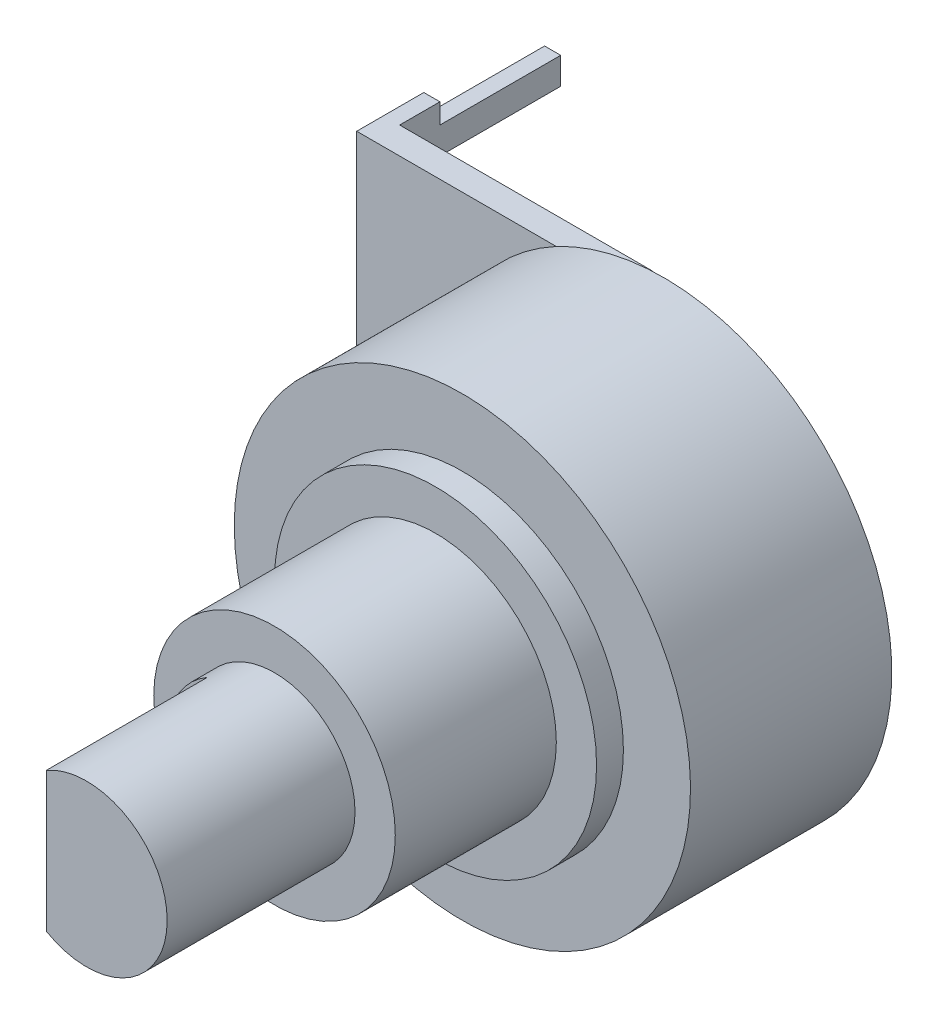
ISO-10303-21;
HEADER;
FILE_DESCRIPTION(('STEP AP214'),'2;1');
FILE_NAME('part.step','',(''),(''),'','','');
FILE_SCHEMA(('AUTOMOTIVE_DESIGN { 1 0 10303 214 1 1 1 1 }'));
ENDSEC;
DATA;
#1=APPLICATION_CONTEXT('core data for automotive mechanical design processes');
#2=APPLICATION_PROTOCOL_DEFINITION('international standard','automotive_design',2000,#1);
#3=PRODUCT_CONTEXT('',#1,'mechanical');
#4=PRODUCT('Part','Part','',(#3));
#5=PRODUCT_RELATED_PRODUCT_CATEGORY('part','',(#4));
#6=PRODUCT_DEFINITION_FORMATION('','',#4);
#7=PRODUCT_DEFINITION_CONTEXT('part definition',#1,'design');
#8=PRODUCT_DEFINITION('design','',#6,#7);
#9=PRODUCT_DEFINITION_SHAPE('','',#8);
#10=(LENGTH_UNIT() NAMED_UNIT(*) SI_UNIT(.MILLI.,.METRE.));
#11=(NAMED_UNIT(*) PLANE_ANGLE_UNIT() SI_UNIT($,.RADIAN.));
#12=(NAMED_UNIT(*) SI_UNIT($,.STERADIAN.) SOLID_ANGLE_UNIT());
#13=UNCERTAINTY_MEASURE_WITH_UNIT(LENGTH_MEASURE(1.E-05),#10,'distance_accuracy_value','');
#14=(GEOMETRIC_REPRESENTATION_CONTEXT(3) GLOBAL_UNCERTAINTY_ASSIGNED_CONTEXT((#13)) GLOBAL_UNIT_ASSIGNED_CONTEXT((#10,
#11,#12)) REPRESENTATION_CONTEXT('',''));
#15=CARTESIAN_POINT('',(0.,0.,0.));
#16=DIRECTION('',(0.,0.,1.));
#17=DIRECTION('',(1.,0.,0.));
#18=AXIS2_PLACEMENT_3D('',#15,#16,#17);
#19=CARTESIAN_POINT('',(0.,0.,-9.5));
#20=DIRECTION('',(0.,0.,-1.));
#21=DIRECTION('',(-1.,0.,0.));
#22=AXIS2_PLACEMENT_3D('',#19,#20,#21);
#23=PLANE('',#22);
#24=DIRECTION('',(0.,-1.,0.));
#25=VECTOR('',#24,1.);
#26=CARTESIAN_POINT('',(-10.8374973362315,-5.,-9.5));
#27=LINE('',#26,#25);
#28=CARTESIAN_POINT('',(-10.8374973362315,-5.,-9.5));
#29=VERTEX_POINT('',#28);
#30=CARTESIAN_POINT('',(-10.8374973362315,-7.5,-9.5));
#31=VERTEX_POINT('',#30);
#32=EDGE_CURVE('E399',#29,#31,#27,.T.);
#33=ORIENTED_EDGE('',*,*,#32,.F.);
#34=DIRECTION('',(1.,0.,0.));
#35=VECTOR('',#34,1.);
#36=CARTESIAN_POINT('',(-11.4374973362315,-5.,-9.5));
#37=LINE('',#36,#35);
#38=CARTESIAN_POINT('',(-11.4374973362315,-5.,-9.5));
#39=VERTEX_POINT('',#38);
#40=EDGE_CURVE('E403',#39,#29,#37,.T.);
#41=ORIENTED_EDGE('',*,*,#40,.F.);
#42=DIRECTION('',(0.,1.,0.));
#43=VECTOR('',#42,1.);
#44=CARTESIAN_POINT('',(-11.4374973362315,7.5,-9.5));
#45=LINE('',#44,#43);
#46=CARTESIAN_POINT('',(-11.4374973362315,-1.25,-9.5));
#47=VERTEX_POINT('',#46);
#48=EDGE_CURVE('E271',#39,#47,#45,.T.);
#49=ORIENTED_EDGE('',*,*,#48,.T.);
#50=DIRECTION('',(-1.,0.,0.));
#51=VECTOR('',#50,1.);
#52=CARTESIAN_POINT('',(-11.4374973362315,-1.25,-9.5));
#53=LINE('',#52,#51);
#54=CARTESIAN_POINT('',(-10.8374973362315,-1.25,-9.5));
#55=VERTEX_POINT('',#54);
#56=EDGE_CURVE('E381',#55,#47,#53,.T.);
#57=ORIENTED_EDGE('',*,*,#56,.F.);
#58=DIRECTION('',(0.,-1.,0.));
#59=VECTOR('',#58,1.);
#60=CARTESIAN_POINT('',(-10.8374973362315,1.25,-9.5));
#61=LINE('',#60,#59);
#62=CARTESIAN_POINT('',(-10.8374973362315,1.25,-9.5));
#63=VERTEX_POINT('',#62);
#64=EDGE_CURVE('E385',#63,#55,#61,.T.);
#65=ORIENTED_EDGE('',*,*,#64,.F.);
#66=DIRECTION('',(1.,0.,0.));
#67=VECTOR('',#66,1.);
#68=CARTESIAN_POINT('',(-11.4374973362315,1.25,-9.5));
#69=LINE('',#68,#67);
#70=CARTESIAN_POINT('',(-11.4374973362315,1.25,-9.5));
#71=VERTEX_POINT('',#70);
#72=EDGE_CURVE('E373',#71,#63,#69,.T.);
#73=ORIENTED_EDGE('',*,*,#72,.F.);
#74=CARTESIAN_POINT('',(-11.4374973362315,5.,-9.5));
#75=VERTEX_POINT('',#74);
#76=EDGE_CURVE('E270',#71,#75,#45,.T.);
#77=ORIENTED_EDGE('',*,*,#76,.T.);
#78=DIRECTION('',(-1.,0.,0.));
#79=VECTOR('',#78,1.);
#80=CARTESIAN_POINT('',(-11.4374973362315,5.,-9.5));
#81=LINE('',#80,#79);
#82=CARTESIAN_POINT('',(-10.8374973362315,5.,-9.5));
#83=VERTEX_POINT('',#82);
#84=EDGE_CURVE('E244',#83,#75,#81,.T.);
#85=ORIENTED_EDGE('',*,*,#84,.F.);
#86=DIRECTION('',(0.,-1.,0.));
#87=VECTOR('',#86,1.);
#88=CARTESIAN_POINT('',(-10.8374973362315,7.5,-9.5));
#89=LINE('',#88,#87);
#90=CARTESIAN_POINT('',(-10.8374973362315,7.5,-9.5));
#91=VERTEX_POINT('',#90);
#92=EDGE_CURVE('E249',#91,#83,#89,.T.);
#93=ORIENTED_EDGE('',*,*,#92,.F.);
#94=DIRECTION('',(1.,0.,0.));
#95=VECTOR('',#94,1.);
#96=CARTESIAN_POINT('',(-1.43749733623151,7.5,-9.5));
#97=LINE('',#96,#95);
#98=CARTESIAN_POINT('',(-1.43749733623151,7.5,-9.5));
#99=VERTEX_POINT('',#98);
#100=EDGE_CURVE('E274',#91,#99,#97,.T.);
#101=ORIENTED_EDGE('',*,*,#100,.T.);
#102=DIRECTION('',(0.,-1.,0.));
#103=VECTOR('',#102,1.);
#104=CARTESIAN_POINT('',(-1.43749733623151,7.5,-9.5));
#105=LINE('',#104,#103);
#106=CARTESIAN_POINT('',(-1.43749733623151,-7.5,-9.5));
#107=VERTEX_POINT('',#106);
#108=EDGE_CURVE('E263',#99,#107,#105,.T.);
#109=ORIENTED_EDGE('',*,*,#108,.T.);
#110=DIRECTION('',(-1.,0.,0.));
#111=VECTOR('',#110,1.);
#112=CARTESIAN_POINT('',(-1.43749733623151,-7.5,-9.5));
#113=LINE('',#112,#111);
#114=EDGE_CURVE('E266',#107,#31,#113,.T.);
#115=ORIENTED_EDGE('',*,*,#114,.T.);
#116=EDGE_LOOP('',(#33,#41,#49,#57,#65,#73,#77,#85,#93,#101,#109,#115));
#117=FACE_BOUND('',#116,.T.);
#118=ADVANCED_FACE('F35',(#117),#23,.T.);
#119=CARTESIAN_POINT('',(0.,0.,6.));
#120=DIRECTION('',(0.,0.,-1.));
#121=DIRECTION('',(-1.,0.,0.));
#122=AXIS2_PLACEMENT_3D('',#119,#120,#121);
#123=CYLINDRICAL_SURFACE('',#122,4.5);
#124=CARTESIAN_POINT('',(0.,0.,6.));
#125=DIRECTION('',(0.,0.,1.));
#126=DIRECTION('',(1.,0.,0.));
#127=AXIS2_PLACEMENT_3D('',#124,#125,#126);
#128=CIRCLE('',#127,4.5);
#129=CARTESIAN_POINT('',(4.5,0.,6.));
#130=VERTEX_POINT('',#129);
#131=EDGE_CURVE('E323',#130,#130,#128,.T.);
#132=ORIENTED_EDGE('',*,*,#131,.F.);
#133=EDGE_LOOP('',(#132));
#134=FACE_BOUND('',#133,.T.);
#135=CARTESIAN_POINT('',(0.,0.,0.));
#136=DIRECTION('',(0.,0.,1.));
#137=DIRECTION('',(1.,0.,0.));
#138=AXIS2_PLACEMENT_3D('',#135,#136,#137);
#139=CIRCLE('',#138,4.5);
#140=CARTESIAN_POINT('',(4.5,0.,0.));
#141=VERTEX_POINT('',#140);
#142=EDGE_CURVE('E308',#141,#141,#139,.T.);
#143=ORIENTED_EDGE('',*,*,#142,.T.);
#144=EDGE_LOOP('',(#143));
#145=FACE_BOUND('',#144,.T.);
#146=ADVANCED_FACE('F37',(#134,#145),#123,.T.);
#147=CARTESIAN_POINT('',(0.,0.,6.));
#148=DIRECTION('',(0.,0.,1.));
#149=DIRECTION('',(1.,0.,0.));
#150=AXIS2_PLACEMENT_3D('',#147,#148,#149);
#151=PLANE('',#150);
#152=CARTESIAN_POINT('',(0.,0.,6.));
#153=DIRECTION('',(0.,0.,1.));
#154=DIRECTION('',(1.,0.,0.));
#155=AXIS2_PLACEMENT_3D('',#152,#153,#154);
#156=CIRCLE('',#155,3.);
#157=CARTESIAN_POINT('',(3.,0.,6.));
#158=VERTEX_POINT('',#157);
#159=EDGE_CURVE('E324',#158,#158,#156,.T.);
#160=ORIENTED_EDGE('',*,*,#159,.F.);
#161=EDGE_LOOP('',(#160));
#162=FACE_BOUND('',#161,.T.);
#163=ORIENTED_EDGE('',*,*,#131,.T.);
#164=EDGE_LOOP('',(#163));
#165=FACE_BOUND('',#164,.T.);
#166=ADVANCED_FACE('F535',(#162,#165),#151,.T.);
#167=CARTESIAN_POINT('',(0.,0.,13.));
#168=DIRECTION('',(0.,0.,-1.));
#169=DIRECTION('',(-1.,0.,0.));
#170=AXIS2_PLACEMENT_3D('',#167,#168,#169);
#171=CYLINDRICAL_SURFACE('',#170,3.);
#172=CARTESIAN_POINT('',(0.,0.,13.));
#173=DIRECTION('',(0.,0.,1.));
#174=DIRECTION('',(1.,0.,0.));
#175=AXIS2_PLACEMENT_3D('',#172,#173,#174);
#176=CIRCLE('',#175,3.);
#177=CARTESIAN_POINT('',(-1.5,-2.59807621135332,13.));
#178=VERTEX_POINT('',#177);
#179=CARTESIAN_POINT('',(-1.5,2.59807621135332,13.));
#180=VERTEX_POINT('',#179);
#181=EDGE_CURVE('E320',#178,#180,#176,.T.);
#182=ORIENTED_EDGE('',*,*,#181,.F.);
#183=DIRECTION('',(0.,0.,-1.));
#184=VECTOR('',#183,1.);
#185=CARTESIAN_POINT('',(-1.5,-2.59807621135332,13.));
#186=LINE('',#185,#184);
#187=CARTESIAN_POINT('',(-1.5,-2.59807621135332,7.));
#188=VERTEX_POINT('',#187);
#189=EDGE_CURVE('E317',#178,#188,#186,.T.);
#190=ORIENTED_EDGE('',*,*,#189,.T.);
#191=CARTESIAN_POINT('',(0.,0.,7.));
#192=DIRECTION('',(0.,0.,1.));
#193=DIRECTION('',(1.,0.,0.));
#194=AXIS2_PLACEMENT_3D('',#191,#192,#193);
#195=CIRCLE('',#194,3.);
#196=CARTESIAN_POINT('',(-1.5,2.59807621135332,7.));
#197=VERTEX_POINT('',#196);
#198=EDGE_CURVE('E333',#197,#188,#195,.T.);
#199=ORIENTED_EDGE('',*,*,#198,.F.);
#200=DIRECTION('',(0.,0.,-1.));
#201=VECTOR('',#200,1.);
#202=CARTESIAN_POINT('',(-1.5,2.59807621135332,13.));
#203=LINE('',#202,#201);
#204=EDGE_CURVE('E314',#197,#180,#203,.F.);
#205=ORIENTED_EDGE('',*,*,#204,.T.);
#206=EDGE_LOOP('',(#182,#190,#199,#205));
#207=FACE_BOUND('',#206,.T.);
#208=ORIENTED_EDGE('',*,*,#159,.T.);
#209=EDGE_LOOP('',(#208));
#210=FACE_BOUND('',#209,.T.);
#211=ADVANCED_FACE('F578',(#207,#210),#171,.T.);
#212=CARTESIAN_POINT('',(0.,0.,13.));
#213=DIRECTION('',(0.,0.,1.));
#214=DIRECTION('',(1.,0.,0.));
#215=AXIS2_PLACEMENT_3D('',#212,#213,#214);
#216=PLANE('',#215);
#217=DIRECTION('',(0.,1.,0.));
#218=VECTOR('',#217,1.);
#219=CARTESIAN_POINT('',(-1.5,0.,13.));
#220=LINE('',#219,#218);
#221=EDGE_CURVE('E327',#178,#180,#220,.T.);
#222=ORIENTED_EDGE('',*,*,#221,.F.);
#223=ORIENTED_EDGE('',*,*,#181,.T.);
#224=EDGE_LOOP('',(#222,#223));
#225=FACE_BOUND('',#224,.T.);
#226=ADVANCED_FACE('F572',(#225),#216,.T.);
#227=CARTESIAN_POINT('',(0.,0.,7.));
#228=DIRECTION('',(0.,0.,1.));
#229=DIRECTION('',(1.,0.,0.));
#230=AXIS2_PLACEMENT_3D('',#227,#228,#229);
#231=PLANE('',#230);
#232=ORIENTED_EDGE('',*,*,#198,.T.);
#233=DIRECTION('',(0.,1.,0.));
#234=VECTOR('',#233,1.);
#235=CARTESIAN_POINT('',(-1.5,3.61488300728811,7.));
#236=LINE('',#235,#234);
#237=EDGE_CURVE('E311',#188,#197,#236,.T.);
#238=ORIENTED_EDGE('',*,*,#237,.T.);
#239=EDGE_LOOP('',(#232,#238));
#240=FACE_BOUND('',#239,.T.);
#241=ADVANCED_FACE('F569',(#240),#231,.T.);
#242=CARTESIAN_POINT('',(-1.5,3.61488300728811,7.));
#243=DIRECTION('',(1.,0.,0.));
#244=DIRECTION('',(0.,1.,0.));
#245=AXIS2_PLACEMENT_3D('',#242,#243,#244);
#246=PLANE('',#245);
#247=ORIENTED_EDGE('',*,*,#221,.T.);
#248=ORIENTED_EDGE('',*,*,#204,.F.);
#249=ORIENTED_EDGE('',*,*,#237,.F.);
#250=ORIENTED_EDGE('',*,*,#189,.F.);
#251=EDGE_LOOP('',(#247,#248,#249,#250));
#252=FACE_BOUND('',#251,.T.);
#253=ADVANCED_FACE('F567',(#252),#246,.F.);
#254=CARTESIAN_POINT('',(0.,0.,-1.));
#255=DIRECTION('',(0.,0.,1.));
#256=DIRECTION('',(1.,0.,0.));
#257=AXIS2_PLACEMENT_3D('',#254,#255,#256);
#258=CYLINDRICAL_SURFACE('',#257,6.);
#259=CARTESIAN_POINT('',(0.,0.,-1.));
#260=DIRECTION('',(0.,0.,-1.));
#261=DIRECTION('',(-1.,0.,0.));
#262=AXIS2_PLACEMENT_3D('',#259,#260,#261);
#263=CIRCLE('',#262,6.);
#264=CARTESIAN_POINT('',(-6.,0.,-1.));
#265=VERTEX_POINT('',#264);
#266=EDGE_CURVE('E305',#265,#265,#263,.T.);
#267=ORIENTED_EDGE('',*,*,#266,.F.);
#268=EDGE_LOOP('',(#267));
#269=FACE_BOUND('',#268,.T.);
#270=CARTESIAN_POINT('',(0.,0.,0.));
#271=DIRECTION('',(0.,0.,-1.));
#272=DIRECTION('',(-1.,0.,0.));
#273=AXIS2_PLACEMENT_3D('',#270,#271,#272);
#274=CIRCLE('',#273,6.);
#275=CARTESIAN_POINT('',(-6.,0.,0.));
#276=VERTEX_POINT('',#275);
#277=EDGE_CURVE('E301',#276,#276,#274,.T.);
#278=ORIENTED_EDGE('',*,*,#277,.T.);
#279=EDGE_LOOP('',(#278));
#280=FACE_BOUND('',#279,.T.);
#281=ADVANCED_FACE('F564',(#269,#280),#258,.T.);
#282=CARTESIAN_POINT('',(0.,0.,0.));
#283=DIRECTION('',(0.,0.,-1.));
#284=DIRECTION('',(-1.,0.,0.));
#285=AXIS2_PLACEMENT_3D('',#282,#283,#284);
#286=PLANE('',#285);
#287=ORIENTED_EDGE('',*,*,#142,.F.);
#288=EDGE_LOOP('',(#287));
#289=FACE_BOUND('',#288,.T.);
#290=ORIENTED_EDGE('',*,*,#277,.F.);
#291=EDGE_LOOP('',(#290));
#292=FACE_BOUND('',#291,.T.);
#293=ADVANCED_FACE('F560',(#289,#292),#286,.F.);
#294=CARTESIAN_POINT('',(0.,0.,-8.5));
#295=DIRECTION('',(0.,0.,1.));
#296=DIRECTION('',(1.,0.,0.));
#297=AXIS2_PLACEMENT_3D('',#294,#295,#296);
#298=CYLINDRICAL_SURFACE('',#297,8.5);
#299=CARTESIAN_POINT('',(0.,0.,-8.5));
#300=DIRECTION('',(0.,0.,-1.));
#301=DIRECTION('',(-1.,0.,0.));
#302=AXIS2_PLACEMENT_3D('',#299,#300,#301);
#303=CIRCLE('',#302,8.5);
#304=CARTESIAN_POINT('',(-4.,7.5,-8.5));
#305=VERTEX_POINT('',#304);
#306=CARTESIAN_POINT('',(-4.,-7.5,-8.5));
#307=VERTEX_POINT('',#306);
#308=EDGE_CURVE('E299',#305,#307,#303,.T.);
#309=ORIENTED_EDGE('',*,*,#308,.F.);
#310=EDGE_CURVE('E302',#307,#305,#303,.T.);
#311=ORIENTED_EDGE('',*,*,#310,.F.);
#312=EDGE_LOOP('',(#309,#311));
#313=FACE_BOUND('',#312,.T.);
#314=CARTESIAN_POINT('',(0.,0.,-1.));
#315=DIRECTION('',(0.,0.,-1.));
#316=DIRECTION('',(-1.,0.,0.));
#317=AXIS2_PLACEMENT_3D('',#314,#315,#316);
#318=CIRCLE('',#317,8.5);
#319=CARTESIAN_POINT('',(-8.5,0.,-1.));
#320=VERTEX_POINT('',#319);
#321=EDGE_CURVE('E298',#320,#320,#318,.T.);
#322=ORIENTED_EDGE('',*,*,#321,.T.);
#323=EDGE_LOOP('',(#322));
#324=FACE_BOUND('',#323,.T.);
#325=ADVANCED_FACE('F554',(#313,#324),#298,.T.);
#326=CARTESIAN_POINT('',(0.,0.,-8.5));
#327=DIRECTION('',(0.,0.,-1.));
#328=DIRECTION('',(-1.,0.,0.));
#329=AXIS2_PLACEMENT_3D('',#326,#327,#328);
#330=PLANE('',#329);
#331=DIRECTION('',(1.,0.,0.));
#332=VECTOR('',#331,1.);
#333=CARTESIAN_POINT('',(-1.43749733623151,7.5,-8.5));
#334=LINE('',#333,#332);
#335=CARTESIAN_POINT('',(-1.43749733623151,7.5,-8.5));
#336=VERTEX_POINT('',#335);
#337=EDGE_CURVE('E288',#305,#336,#334,.T.);
#338=ORIENTED_EDGE('',*,*,#337,.F.);
#339=ORIENTED_EDGE('',*,*,#308,.T.);
#340=DIRECTION('',(-1.,0.,0.));
#341=VECTOR('',#340,1.);
#342=CARTESIAN_POINT('',(-1.43749733623151,-7.5,-8.5));
#343=LINE('',#342,#341);
#344=CARTESIAN_POINT('',(-1.43749733623151,-7.5,-8.5));
#345=VERTEX_POINT('',#344);
#346=EDGE_CURVE('E280',#345,#307,#343,.T.);
#347=ORIENTED_EDGE('',*,*,#346,.F.);
#348=DIRECTION('',(0.,-1.,0.));
#349=VECTOR('',#348,1.);
#350=CARTESIAN_POINT('',(-1.43749733623151,7.5,-8.5));
#351=LINE('',#350,#349);
#352=EDGE_CURVE('E262',#336,#345,#351,.T.);
#353=ORIENTED_EDGE('',*,*,#352,.F.);
#354=EDGE_LOOP('',(#338,#339,#347,#353));
#355=FACE_BOUND('',#354,.T.);
#356=ADVANCED_FACE('F551',(#355),#330,.T.);
#357=CARTESIAN_POINT('',(0.,0.,-1.));
#358=DIRECTION('',(0.,0.,-1.));
#359=DIRECTION('',(-1.,0.,0.));
#360=AXIS2_PLACEMENT_3D('',#357,#358,#359);
#361=PLANE('',#360);
#362=ORIENTED_EDGE('',*,*,#266,.T.);
#363=EDGE_LOOP('',(#362));
#364=FACE_BOUND('',#363,.T.);
#365=ORIENTED_EDGE('',*,*,#321,.F.);
#366=EDGE_LOOP('',(#365));
#367=FACE_BOUND('',#366,.T.);
#368=ADVANCED_FACE('F540',(#364,#367),#361,.F.);
#369=CARTESIAN_POINT('',(0.,0.,-8.5));
#370=DIRECTION('',(0.,0.,-1.));
#371=DIRECTION('',(-1.,0.,0.));
#372=AXIS2_PLACEMENT_3D('',#369,#370,#371);
#373=PLANE('',#372);
#374=CARTESIAN_POINT('',(-11.4374973362315,-7.5,-8.5));
#375=VERTEX_POINT('',#374);
#376=EDGE_CURVE('E279',#307,#375,#343,.T.);
#377=ORIENTED_EDGE('',*,*,#376,.F.);
#378=ORIENTED_EDGE('',*,*,#310,.T.);
#379=CARTESIAN_POINT('',(-11.4374973362315,7.5,-8.5));
#380=VERTEX_POINT('',#379);
#381=EDGE_CURVE('E267',#380,#305,#334,.T.);
#382=ORIENTED_EDGE('',*,*,#381,.F.);
#383=DIRECTION('',(0.,1.,0.));
#384=VECTOR('',#383,1.);
#385=CARTESIAN_POINT('',(-11.4374973362315,7.5,-8.5));
#386=LINE('',#385,#384);
#387=EDGE_CURVE('E283',#375,#380,#386,.T.);
#388=ORIENTED_EDGE('',*,*,#387,.F.);
#389=EDGE_LOOP('',(#377,#378,#382,#388));
#390=FACE_BOUND('',#389,.T.);
#391=ADVANCED_FACE('F492',(#390),#373,.F.);
#392=CARTESIAN_POINT('',(-1.43749733623151,7.5,-9.5));
#393=DIRECTION('',(-1.,0.,0.));
#394=DIRECTION('',(0.,0.,1.));
#395=AXIS2_PLACEMENT_3D('',#392,#393,#394);
#396=PLANE('',#395);
#397=ORIENTED_EDGE('',*,*,#352,.T.);
#398=DIRECTION('',(0.,0.,1.));
#399=VECTOR('',#398,1.);
#400=CARTESIAN_POINT('',(-1.43749733623151,-7.5,-9.5));
#401=LINE('',#400,#399);
#402=EDGE_CURVE('E295',#107,#345,#401,.T.);
#403=ORIENTED_EDGE('',*,*,#402,.F.);
#404=ORIENTED_EDGE('',*,*,#108,.F.);
#405=DIRECTION('',(0.,0.,1.));
#406=VECTOR('',#405,1.);
#407=CARTESIAN_POINT('',(-1.43749733623151,7.5,-9.5));
#408=LINE('',#407,#406);
#409=EDGE_CURVE('E276',#99,#336,#408,.T.);
#410=ORIENTED_EDGE('',*,*,#409,.T.);
#411=EDGE_LOOP('',(#397,#403,#404,#410));
#412=FACE_BOUND('',#411,.T.);
#413=ADVANCED_FACE('F500',(#412),#396,.F.);
#414=CARTESIAN_POINT('',(-1.43749733623151,-7.5,-9.5));
#415=DIRECTION('',(0.,1.,0.));
#416=DIRECTION('',(0.,0.,1.));
#417=AXIS2_PLACEMENT_3D('',#414,#415,#416);
#418=PLANE('',#417);
#419=DIRECTION('',(0.,0.,1.));
#420=VECTOR('',#419,1.);
#421=CARTESIAN_POINT('',(-11.4374973362315,-7.5,-9.5));
#422=LINE('',#421,#420);
#423=CARTESIAN_POINT('',(-11.4374973362315,-7.5,-11.));
#424=VERTEX_POINT('',#423);
#425=EDGE_CURVE('E293',#424,#375,#422,.T.);
#426=ORIENTED_EDGE('',*,*,#425,.F.);
#427=DIRECTION('',(-1.,0.,0.));
#428=VECTOR('',#427,1.);
#429=CARTESIAN_POINT('',(8.5,-7.5,-11.));
#430=LINE('',#429,#428);
#431=CARTESIAN_POINT('',(-10.8374973362315,-7.5,-11.));
#432=VERTEX_POINT('',#431);
#433=EDGE_CURVE('E431',#432,#424,#430,.T.);
#434=ORIENTED_EDGE('',*,*,#433,.F.);
#435=DIRECTION('',(0.,0.,1.));
#436=VECTOR('',#435,1.);
#437=CARTESIAN_POINT('',(-10.8374973362315,-7.5,-15.5));
#438=LINE('',#437,#436);
#439=EDGE_CURVE('E396',#432,#31,#438,.T.);
#440=ORIENTED_EDGE('',*,*,#439,.T.);
#441=ORIENTED_EDGE('',*,*,#114,.F.);
#442=ORIENTED_EDGE('',*,*,#402,.T.);
#443=ORIENTED_EDGE('',*,*,#346,.T.);
#444=ORIENTED_EDGE('',*,*,#376,.T.);
#445=EDGE_LOOP('',(#426,#434,#440,#441,#442,#443,#444));
#446=FACE_BOUND('',#445,.T.);
#447=ADVANCED_FACE('F545',(#446),#418,.F.);
#448=CARTESIAN_POINT('',(-11.4374973362315,7.5,-9.5));
#449=DIRECTION('',(1.,0.,0.));
#450=DIRECTION('',(0.,0.,-1.));
#451=AXIS2_PLACEMENT_3D('',#448,#449,#450);
#452=PLANE('',#451);
#453=DIRECTION('',(0.,0.,1.));
#454=VECTOR('',#453,1.);
#455=CARTESIAN_POINT('',(-11.4374973362315,7.5,-9.5));
#456=LINE('',#455,#454);
#457=CARTESIAN_POINT('',(-11.4374973362315,7.5,-11.));
#458=VERTEX_POINT('',#457);
#459=EDGE_CURVE('E291',#458,#380,#456,.T.);
#460=ORIENTED_EDGE('',*,*,#459,.F.);
#461=DIRECTION('',(0.,1.,0.));
#462=VECTOR('',#461,1.);
#463=CARTESIAN_POINT('',(-11.4374973362315,7.5,-11.));
#464=LINE('',#463,#462);
#465=CARTESIAN_POINT('',(-11.4374973362315,6.75,-11.));
#466=VERTEX_POINT('',#465);
#467=EDGE_CURVE('E239',#466,#458,#464,.T.);
#468=ORIENTED_EDGE('',*,*,#467,.F.);
#469=DIRECTION('',(0.,0.,1.));
#470=VECTOR('',#469,1.);
#471=CARTESIAN_POINT('',(-11.4374973362315,6.75,-15.5));
#472=LINE('',#471,#470);
#473=CARTESIAN_POINT('',(-11.4374973362315,6.75,-15.5));
#474=VERTEX_POINT('',#473);
#475=EDGE_CURVE('E227',#474,#466,#472,.T.);
#476=ORIENTED_EDGE('',*,*,#475,.F.);
#477=DIRECTION('',(0.,1.,0.));
#478=VECTOR('',#477,1.);
#479=CARTESIAN_POINT('',(-11.4374973362315,7.5,-15.5));
#480=LINE('',#479,#478);
#481=CARTESIAN_POINT('',(-11.4374973362315,5.75,-15.5));
#482=VERTEX_POINT('',#481);
#483=EDGE_CURVE('E238',#482,#474,#480,.T.);
#484=ORIENTED_EDGE('',*,*,#483,.F.);
#485=DIRECTION('',(0.,0.,-1.));
#486=VECTOR('',#485,1.);
#487=CARTESIAN_POINT('',(-11.4374973362315,5.75,-15.5));
#488=LINE('',#487,#486);
#489=CARTESIAN_POINT('',(-11.4374973362315,5.75,-11.));
#490=VERTEX_POINT('',#489);
#491=EDGE_CURVE('E58',#490,#482,#488,.T.);
#492=ORIENTED_EDGE('',*,*,#491,.F.);
#493=DIRECTION('',(0.,1.,0.));
#494=VECTOR('',#493,1.);
#495=CARTESIAN_POINT('',(-11.4374973362315,5.,-11.));
#496=LINE('',#495,#494);
#497=CARTESIAN_POINT('',(-11.4374973362315,5.,-11.));
#498=VERTEX_POINT('',#497);
#499=EDGE_CURVE('E464',#498,#490,#496,.T.);
#500=ORIENTED_EDGE('',*,*,#499,.F.);
#501=DIRECTION('',(0.,0.,1.));
#502=VECTOR('',#501,1.);
#503=CARTESIAN_POINT('',(-11.4374973362315,5.,-15.5));
#504=LINE('',#503,#502);
#505=EDGE_CURVE('E246',#498,#75,#504,.T.);
#506=ORIENTED_EDGE('',*,*,#505,.T.);
#507=ORIENTED_EDGE('',*,*,#76,.F.);
#508=DIRECTION('',(0.,0.,1.));
#509=VECTOR('',#508,1.);
#510=CARTESIAN_POINT('',(-11.4374973362315,1.25,-15.5));
#511=LINE('',#510,#509);
#512=CARTESIAN_POINT('',(-11.4374973362315,1.25,-11.));
#513=VERTEX_POINT('',#512);
#514=EDGE_CURVE('E252',#513,#71,#511,.T.);
#515=ORIENTED_EDGE('',*,*,#514,.F.);
#516=DIRECTION('',(0.,1.,0.));
#517=VECTOR('',#516,1.);
#518=CARTESIAN_POINT('',(-11.4374973362315,1.25,-11.));
#519=LINE('',#518,#517);
#520=CARTESIAN_POINT('',(-11.4374973362315,0.500000000000001,-11.));
#521=VERTEX_POINT('',#520);
#522=EDGE_CURVE('E462',#521,#513,#519,.T.);
#523=ORIENTED_EDGE('',*,*,#522,.F.);
#524=DIRECTION('',(0.,0.,1.));
#525=VECTOR('',#524,1.);
#526=CARTESIAN_POINT('',(-11.4374973362315,0.500000000000001,-15.5));
#527=LINE('',#526,#525);
#528=CARTESIAN_POINT('',(-11.4374973362315,0.500000000000001,-15.5));
#529=VERTEX_POINT('',#528);
#530=EDGE_CURVE('E456',#529,#521,#527,.T.);
#531=ORIENTED_EDGE('',*,*,#530,.F.);
#532=DIRECTION('',(0.,1.,0.));
#533=VECTOR('',#532,1.);
#534=CARTESIAN_POINT('',(-11.4374973362315,1.25,-15.5));
#535=LINE('',#534,#533);
#536=CARTESIAN_POINT('',(-11.4374973362315,-0.499999999999999,-15.5));
#537=VERTEX_POINT('',#536);
#538=EDGE_CURVE('E384',#537,#529,#535,.T.);
#539=ORIENTED_EDGE('',*,*,#538,.F.);
#540=DIRECTION('',(0.,0.,-1.));
#541=VECTOR('',#540,1.);
#542=CARTESIAN_POINT('',(-11.4374973362315,-0.499999999999999,-15.5));
#543=LINE('',#542,#541);
#544=CARTESIAN_POINT('',(-11.4374973362315,-0.499999999999999,-11.));
#545=VERTEX_POINT('',#544);
#546=EDGE_CURVE('E454',#545,#537,#543,.T.);
#547=ORIENTED_EDGE('',*,*,#546,.F.);
#548=DIRECTION('',(0.,1.,0.));
#549=VECTOR('',#548,1.);
#550=CARTESIAN_POINT('',(-11.4374973362315,-1.25,-11.));
#551=LINE('',#550,#549);
#552=CARTESIAN_POINT('',(-11.4374973362315,-1.25,-11.));
#553=VERTEX_POINT('',#552);
#554=EDGE_CURVE('E447',#553,#545,#551,.T.);
#555=ORIENTED_EDGE('',*,*,#554,.F.);
#556=DIRECTION('',(0.,0.,1.));
#557=VECTOR('',#556,1.);
#558=CARTESIAN_POINT('',(-11.4374973362315,-1.25,-15.5));
#559=LINE('',#558,#557);
#560=EDGE_CURVE('E376',#553,#47,#559,.T.);
#561=ORIENTED_EDGE('',*,*,#560,.T.);
#562=ORIENTED_EDGE('',*,*,#48,.F.);
#563=DIRECTION('',(0.,0.,1.));
#564=VECTOR('',#563,1.);
#565=CARTESIAN_POINT('',(-11.4374973362315,-5.,-15.5));
#566=LINE('',#565,#564);
#567=CARTESIAN_POINT('',(-11.4374973362315,-5.,-11.));
#568=VERTEX_POINT('',#567);
#569=EDGE_CURVE('E388',#568,#39,#566,.T.);
#570=ORIENTED_EDGE('',*,*,#569,.F.);
#571=DIRECTION('',(0.,1.,0.));
#572=VECTOR('',#571,1.);
#573=CARTESIAN_POINT('',(-11.4374973362315,-5.,-11.));
#574=LINE('',#573,#572);
#575=CARTESIAN_POINT('',(-11.4374973362315,-5.75,-11.));
#576=VERTEX_POINT('',#575);
#577=EDGE_CURVE('E444',#576,#568,#574,.T.);
#578=ORIENTED_EDGE('',*,*,#577,.F.);
#579=DIRECTION('',(0.,0.,1.));
#580=VECTOR('',#579,1.);
#581=CARTESIAN_POINT('',(-11.4374973362315,-5.75,-15.5));
#582=LINE('',#581,#580);
#583=CARTESIAN_POINT('',(-11.4374973362315,-5.75,-15.5));
#584=VERTEX_POINT('',#583);
#585=EDGE_CURVE('E436',#584,#576,#582,.T.);
#586=ORIENTED_EDGE('',*,*,#585,.F.);
#587=DIRECTION('',(0.,1.,0.));
#588=VECTOR('',#587,1.);
#589=CARTESIAN_POINT('',(-11.4374973362315,-5.,-15.5));
#590=LINE('',#589,#588);
#591=CARTESIAN_POINT('',(-11.4374973362315,-6.75,-15.5));
#592=VERTEX_POINT('',#591);
#593=EDGE_CURVE('E402',#592,#584,#590,.T.);
#594=ORIENTED_EDGE('',*,*,#593,.F.);
#595=DIRECTION('',(0.,0.,-1.));
#596=VECTOR('',#595,1.);
#597=CARTESIAN_POINT('',(-11.4374973362315,-6.75,-15.5));
#598=LINE('',#597,#596);
#599=CARTESIAN_POINT('',(-11.4374973362315,-6.75,-11.));
#600=VERTEX_POINT('',#599);
#601=EDGE_CURVE('E434',#600,#592,#598,.T.);
#602=ORIENTED_EDGE('',*,*,#601,.F.);
#603=DIRECTION('',(0.,1.,0.));
#604=VECTOR('',#603,1.);
#605=CARTESIAN_POINT('',(-11.4374973362315,-7.5,-11.));
#606=LINE('',#605,#604);
#607=EDGE_CURVE('E438',#424,#600,#606,.T.);
#608=ORIENTED_EDGE('',*,*,#607,.F.);
#609=ORIENTED_EDGE('',*,*,#425,.T.);
#610=ORIENTED_EDGE('',*,*,#387,.T.);
#611=EDGE_LOOP('',(#460,#468,#476,#484,#492,#500,#506,#507,#515,#523,#531,#539,#547,#555,#561,
#562,#570,#578,#586,#594,#602,#608,#609,#610));
#612=FACE_BOUND('',#611,.T.);
#613=ADVANCED_FACE('F237',(#612),#452,.F.);
#614=CARTESIAN_POINT('',(-1.43749733623151,7.5,-9.5));
#615=DIRECTION('',(0.,-1.,0.));
#616=DIRECTION('',(0.,0.,-1.));
#617=AXIS2_PLACEMENT_3D('',#614,#615,#616);
#618=PLANE('',#617);
#619=DIRECTION('',(0.,0.,1.));
#620=VECTOR('',#619,1.);
#621=CARTESIAN_POINT('',(-10.8374973362315,7.5,-15.5));
#622=LINE('',#621,#620);
#623=CARTESIAN_POINT('',(-10.8374973362315,7.5,-11.));
#624=VERTEX_POINT('',#623);
#625=EDGE_CURVE('E260',#624,#91,#622,.T.);
#626=ORIENTED_EDGE('',*,*,#625,.F.);
#627=DIRECTION('',(-1.,0.,0.));
#628=VECTOR('',#627,1.);
#629=CARTESIAN_POINT('',(8.5,7.5,-11.));
#630=LINE('',#629,#628);
#631=EDGE_CURVE('E430',#624,#458,#630,.T.);
#632=ORIENTED_EDGE('',*,*,#631,.T.);
#633=ORIENTED_EDGE('',*,*,#459,.T.);
#634=ORIENTED_EDGE('',*,*,#381,.T.);
#635=ORIENTED_EDGE('',*,*,#337,.T.);
#636=ORIENTED_EDGE('',*,*,#409,.F.);
#637=ORIENTED_EDGE('',*,*,#100,.F.);
#638=EDGE_LOOP('',(#626,#632,#633,#634,#635,#636,#637));
#639=FACE_BOUND('',#638,.T.);
#640=ADVANCED_FACE('F482',(#639),#618,.F.);
#641=CARTESIAN_POINT('',(-10.8374973362315,7.5,-15.5));
#642=DIRECTION('',(-1.,0.,0.));
#643=DIRECTION('',(0.,-1.,0.));
#644=AXIS2_PLACEMENT_3D('',#641,#642,#643);
#645=PLANE('',#644);
#646=DIRECTION('',(0.,0.,1.));
#647=VECTOR('',#646,1.);
#648=CARTESIAN_POINT('',(-10.8374973362315,6.75,-15.5));
#649=LINE('',#648,#647);
#650=CARTESIAN_POINT('',(-10.8374973362315,6.75,-15.5));
#651=VERTEX_POINT('',#650);
#652=CARTESIAN_POINT('',(-10.8374973362315,6.75,-11.));
#653=VERTEX_POINT('',#652);
#654=EDGE_CURVE('E50',#651,#653,#649,.T.);
#655=ORIENTED_EDGE('',*,*,#654,.T.);
#656=DIRECTION('',(0.,1.,0.));
#657=VECTOR('',#656,1.);
#658=CARTESIAN_POINT('',(-10.8374973362315,7.50000000000001,-11.));
#659=LINE('',#658,#657);
#660=EDGE_CURVE('E11',#653,#624,#659,.T.);
#661=ORIENTED_EDGE('',*,*,#660,.T.);
#662=ORIENTED_EDGE('',*,*,#625,.T.);
#663=ORIENTED_EDGE('',*,*,#92,.T.);
#664=DIRECTION('',(0.,0.,1.));
#665=VECTOR('',#664,1.);
#666=CARTESIAN_POINT('',(-10.8374973362315,5.,-15.5));
#667=LINE('',#666,#665);
#668=CARTESIAN_POINT('',(-10.8374973362315,5.,-11.));
#669=VERTEX_POINT('',#668);
#670=EDGE_CURVE('E258',#669,#83,#667,.T.);
#671=ORIENTED_EDGE('',*,*,#670,.F.);
#672=DIRECTION('',(0.,1.,0.));
#673=VECTOR('',#672,1.);
#674=CARTESIAN_POINT('',(-10.8374973362315,7.5,-11.));
#675=LINE('',#674,#673);
#676=CARTESIAN_POINT('',(-10.8374973362315,5.75,-11.));
#677=VERTEX_POINT('',#676);
#678=EDGE_CURVE('E406',#669,#677,#675,.T.);
#679=ORIENTED_EDGE('',*,*,#678,.T.);
#680=DIRECTION('',(0.,0.,-1.));
#681=VECTOR('',#680,1.);
#682=CARTESIAN_POINT('',(-10.8374973362315,5.75,-15.5));
#683=LINE('',#682,#681);
#684=CARTESIAN_POINT('',(-10.8374973362315,5.75,-15.5));
#685=VERTEX_POINT('',#684);
#686=EDGE_CURVE('E414',#677,#685,#683,.T.);
#687=ORIENTED_EDGE('',*,*,#686,.T.);
#688=DIRECTION('',(0.,-1.,0.));
#689=VECTOR('',#688,1.);
#690=CARTESIAN_POINT('',(-10.8374973362315,7.5,-15.5));
#691=LINE('',#690,#689);
#692=EDGE_CURVE('E243',#651,#685,#691,.T.);
#693=ORIENTED_EDGE('',*,*,#692,.F.);
#694=EDGE_LOOP('',(#655,#661,#662,#663,#671,#679,#687,#693));
#695=FACE_BOUND('',#694,.T.);
#696=ADVANCED_FACE('F509',(#695),#645,.F.);
#697=CARTESIAN_POINT('',(-11.4374973362315,5.,-15.5));
#698=DIRECTION('',(0.,1.,0.));
#699=DIRECTION('',(0.,0.,1.));
#700=AXIS2_PLACEMENT_3D('',#697,#698,#699);
#701=PLANE('',#700);
#702=ORIENTED_EDGE('',*,*,#505,.F.);
#703=DIRECTION('',(-1.,0.,0.));
#704=VECTOR('',#703,1.);
#705=CARTESIAN_POINT('',(8.5,5.,-11.));
#706=LINE('',#705,#704);
#707=EDGE_CURVE('E468',#669,#498,#706,.T.);
#708=ORIENTED_EDGE('',*,*,#707,.F.);
#709=ORIENTED_EDGE('',*,*,#670,.T.);
#710=ORIENTED_EDGE('',*,*,#84,.T.);
#711=EDGE_LOOP('',(#702,#708,#709,#710));
#712=FACE_BOUND('',#711,.T.);
#713=ADVANCED_FACE('F519',(#712),#701,.F.);
#714=CARTESIAN_POINT('',(0.,0.,-15.5));
#715=DIRECTION('',(0.,0.,1.));
#716=DIRECTION('',(1.,0.,0.));
#717=AXIS2_PLACEMENT_3D('',#714,#715,#716);
#718=PLANE('',#717);
#719=ORIENTED_EDGE('',*,*,#483,.T.);
#720=DIRECTION('',(1.,0.,0.));
#721=VECTOR('',#720,1.);
#722=CARTESIAN_POINT('',(0.,6.75,-15.5));
#723=LINE('',#722,#721);
#724=EDGE_CURVE('E43',#474,#651,#723,.T.);
#725=ORIENTED_EDGE('',*,*,#724,.T.);
#726=ORIENTED_EDGE('',*,*,#692,.T.);
#727=DIRECTION('',(-1.,0.,0.));
#728=VECTOR('',#727,1.);
#729=CARTESIAN_POINT('',(0.,5.75,-15.5));
#730=LINE('',#729,#728);
#731=EDGE_CURVE('E233',#685,#482,#730,.T.);
#732=ORIENTED_EDGE('',*,*,#731,.T.);
#733=EDGE_LOOP('',(#719,#725,#726,#732));
#734=FACE_BOUND('',#733,.T.);
#735=ADVANCED_FACE('F242',(#734),#718,.F.);
#736=CARTESIAN_POINT('',(-11.4374973362315,1.25,-15.5));
#737=DIRECTION('',(0.,-1.,0.));
#738=DIRECTION('',(0.,0.,-1.));
#739=AXIS2_PLACEMENT_3D('',#736,#737,#738);
#740=PLANE('',#739);
#741=DIRECTION('',(0.,0.,1.));
#742=VECTOR('',#741,1.);
#743=CARTESIAN_POINT('',(-10.8374973362315,1.25,-15.5));
#744=LINE('',#743,#742);
#745=CARTESIAN_POINT('',(-10.8374973362315,1.25,-11.));
#746=VERTEX_POINT('',#745);
#747=EDGE_CURVE('E361',#746,#63,#744,.T.);
#748=ORIENTED_EDGE('',*,*,#747,.F.);
#749=DIRECTION('',(-1.,0.,0.));
#750=VECTOR('',#749,1.);
#751=CARTESIAN_POINT('',(8.5,1.25,-11.));
#752=LINE('',#751,#750);
#753=EDGE_CURVE('E370',#746,#513,#752,.T.);
#754=ORIENTED_EDGE('',*,*,#753,.T.);
#755=ORIENTED_EDGE('',*,*,#514,.T.);
#756=ORIENTED_EDGE('',*,*,#72,.T.);
#757=EDGE_LOOP('',(#748,#754,#755,#756));
#758=FACE_BOUND('',#757,.T.);
#759=ADVANCED_FACE('F369',(#758),#740,.F.);
#760=CARTESIAN_POINT('',(-10.8374973362315,1.25,-15.5));
#761=DIRECTION('',(-1.,0.,0.));
#762=DIRECTION('',(0.,0.,1.));
#763=AXIS2_PLACEMENT_3D('',#760,#761,#762);
#764=PLANE('',#763);
#765=DIRECTION('',(0.,0.,1.));
#766=VECTOR('',#765,1.);
#767=CARTESIAN_POINT('',(-10.8374973362315,0.500000000000001,-15.5));
#768=LINE('',#767,#766);
#769=CARTESIAN_POINT('',(-10.8374973362315,0.500000000000001,-15.5));
#770=VERTEX_POINT('',#769);
#771=CARTESIAN_POINT('',(-10.8374973362315,0.500000000000001,-11.));
#772=VERTEX_POINT('',#771);
#773=EDGE_CURVE('E364',#770,#772,#768,.T.);
#774=ORIENTED_EDGE('',*,*,#773,.T.);
#775=DIRECTION('',(0.,1.,0.));
#776=VECTOR('',#775,1.);
#777=CARTESIAN_POINT('',(-10.8374973362315,1.25,-11.));
#778=LINE('',#777,#776);
#779=EDGE_CURVE('E353',#772,#746,#778,.T.);
#780=ORIENTED_EDGE('',*,*,#779,.T.);
#781=ORIENTED_EDGE('',*,*,#747,.T.);
#782=ORIENTED_EDGE('',*,*,#64,.T.);
#783=DIRECTION('',(0.,0.,1.));
#784=VECTOR('',#783,1.);
#785=CARTESIAN_POINT('',(-10.8374973362315,-1.25,-15.5));
#786=LINE('',#785,#784);
#787=CARTESIAN_POINT('',(-10.8374973362315,-1.25,-11.));
#788=VERTEX_POINT('',#787);
#789=EDGE_CURVE('E375',#788,#55,#786,.T.);
#790=ORIENTED_EDGE('',*,*,#789,.F.);
#791=DIRECTION('',(0.,1.,0.));
#792=VECTOR('',#791,1.);
#793=CARTESIAN_POINT('',(-10.8374973362315,1.25,-11.));
#794=LINE('',#793,#792);
#795=CARTESIAN_POINT('',(-10.8374973362315,-0.499999999999999,-11.));
#796=VERTEX_POINT('',#795);
#797=EDGE_CURVE('E417',#788,#796,#794,.T.);
#798=ORIENTED_EDGE('',*,*,#797,.T.);
#799=DIRECTION('',(0.,0.,-1.));
#800=VECTOR('',#799,1.);
#801=CARTESIAN_POINT('',(-10.8374973362315,-0.499999999999999,-15.5));
#802=LINE('',#801,#800);
#803=CARTESIAN_POINT('',(-10.8374973362315,-0.499999999999999,-15.5));
#804=VERTEX_POINT('',#803);
#805=EDGE_CURVE('E421',#796,#804,#802,.T.);
#806=ORIENTED_EDGE('',*,*,#805,.T.);
#807=DIRECTION('',(0.,-1.,0.));
#808=VECTOR('',#807,1.);
#809=CARTESIAN_POINT('',(-10.8374973362315,1.25,-15.5));
#810=LINE('',#809,#808);
#811=EDGE_CURVE('E380',#770,#804,#810,.T.);
#812=ORIENTED_EDGE('',*,*,#811,.F.);
#813=EDGE_LOOP('',(#774,#780,#781,#782,#790,#798,#806,#812));
#814=FACE_BOUND('',#813,.T.);
#815=ADVANCED_FACE('F359',(#814),#764,.F.);
#816=CARTESIAN_POINT('',(-11.4374973362315,-1.25,-15.5));
#817=DIRECTION('',(0.,1.,0.));
#818=DIRECTION('',(0.,0.,1.));
#819=AXIS2_PLACEMENT_3D('',#816,#817,#818);
#820=PLANE('',#819);
#821=ORIENTED_EDGE('',*,*,#560,.F.);
#822=DIRECTION('',(-1.,0.,0.));
#823=VECTOR('',#822,1.);
#824=CARTESIAN_POINT('',(8.5,-1.25,-11.));
#825=LINE('',#824,#823);
#826=EDGE_CURVE('E451',#788,#553,#825,.T.);
#827=ORIENTED_EDGE('',*,*,#826,.F.);
#828=ORIENTED_EDGE('',*,*,#789,.T.);
#829=ORIENTED_EDGE('',*,*,#56,.T.);
#830=EDGE_LOOP('',(#821,#827,#828,#829));
#831=FACE_BOUND('',#830,.T.);
#832=ADVANCED_FACE('F714',(#831),#820,.F.);
#833=CARTESIAN_POINT('',(0.,0.,-15.5));
#834=DIRECTION('',(0.,0.,1.));
#835=DIRECTION('',(1.,0.,0.));
#836=AXIS2_PLACEMENT_3D('',#833,#834,#835);
#837=PLANE('',#836);
#838=ORIENTED_EDGE('',*,*,#538,.T.);
#839=DIRECTION('',(1.,0.,0.));
#840=VECTOR('',#839,1.);
#841=CARTESIAN_POINT('',(0.,0.500000000000001,-15.5));
#842=LINE('',#841,#840);
#843=EDGE_CURVE('E350',#529,#770,#842,.T.);
#844=ORIENTED_EDGE('',*,*,#843,.T.);
#845=ORIENTED_EDGE('',*,*,#811,.T.);
#846=DIRECTION('',(-1.,0.,0.));
#847=VECTOR('',#846,1.);
#848=CARTESIAN_POINT('',(0.,-0.499999999999999,-15.5));
#849=LINE('',#848,#847);
#850=EDGE_CURVE('E347',#804,#537,#849,.T.);
#851=ORIENTED_EDGE('',*,*,#850,.T.);
#852=EDGE_LOOP('',(#838,#844,#845,#851));
#853=FACE_BOUND('',#852,.T.);
#854=ADVANCED_FACE('F723',(#853),#837,.F.);
#855=CARTESIAN_POINT('',(-11.4374973362315,-5.,-15.5));
#856=DIRECTION('',(0.,-1.,0.));
#857=DIRECTION('',(0.,0.,-1.));
#858=AXIS2_PLACEMENT_3D('',#855,#856,#857);
#859=PLANE('',#858);
#860=DIRECTION('',(0.,0.,1.));
#861=VECTOR('',#860,1.);
#862=CARTESIAN_POINT('',(-10.8374973362315,-5.,-15.5));
#863=LINE('',#862,#861);
#864=CARTESIAN_POINT('',(-10.8374973362315,-5.,-11.));
#865=VERTEX_POINT('',#864);
#866=EDGE_CURVE('E394',#865,#29,#863,.T.);
#867=ORIENTED_EDGE('',*,*,#866,.F.);
#868=DIRECTION('',(-1.,0.,0.));
#869=VECTOR('',#868,1.);
#870=CARTESIAN_POINT('',(8.5,-5.,-11.));
#871=LINE('',#870,#869);
#872=EDGE_CURVE('E443',#865,#568,#871,.T.);
#873=ORIENTED_EDGE('',*,*,#872,.T.);
#874=ORIENTED_EDGE('',*,*,#569,.T.);
#875=ORIENTED_EDGE('',*,*,#40,.T.);
#876=EDGE_LOOP('',(#867,#873,#874,#875));
#877=FACE_BOUND('',#876,.T.);
#878=ADVANCED_FACE('F733',(#877),#859,.F.);
#879=CARTESIAN_POINT('',(-10.8374973362315,-5.,-15.5));
#880=DIRECTION('',(-1.,0.,0.));
#881=DIRECTION('',(0.,0.,1.));
#882=AXIS2_PLACEMENT_3D('',#879,#880,#881);
#883=PLANE('',#882);
#884=DIRECTION('',(0.,0.,1.));
#885=VECTOR('',#884,1.);
#886=CARTESIAN_POINT('',(-10.8374973362315,-5.75,-15.5));
#887=LINE('',#886,#885);
#888=CARTESIAN_POINT('',(-10.8374973362315,-5.75,-15.5));
#889=VERTEX_POINT('',#888);
#890=CARTESIAN_POINT('',(-10.8374973362315,-5.75,-11.));
#891=VERTEX_POINT('',#890);
#892=EDGE_CURVE('E424',#889,#891,#887,.T.);
#893=ORIENTED_EDGE('',*,*,#892,.T.);
#894=DIRECTION('',(0.,1.,0.));
#895=VECTOR('',#894,1.);
#896=CARTESIAN_POINT('',(-10.8374973362315,-5.,-11.));
#897=LINE('',#896,#895);
#898=EDGE_CURVE('E344',#891,#865,#897,.T.);
#899=ORIENTED_EDGE('',*,*,#898,.T.);
#900=ORIENTED_EDGE('',*,*,#866,.T.);
#901=ORIENTED_EDGE('',*,*,#32,.T.);
#902=ORIENTED_EDGE('',*,*,#439,.F.);
#903=DIRECTION('',(0.,1.,0.));
#904=VECTOR('',#903,1.);
#905=CARTESIAN_POINT('',(-10.8374973362315,-5.,-11.));
#906=LINE('',#905,#904);
#907=CARTESIAN_POINT('',(-10.8374973362315,-6.75,-11.));
#908=VERTEX_POINT('',#907);
#909=EDGE_CURVE('E341',#432,#908,#906,.T.);
#910=ORIENTED_EDGE('',*,*,#909,.T.);
#911=DIRECTION('',(0.,0.,-1.));
#912=VECTOR('',#911,1.);
#913=CARTESIAN_POINT('',(-10.8374973362315,-6.75,-15.5));
#914=LINE('',#913,#912);
#915=CARTESIAN_POINT('',(-10.8374973362315,-6.75,-15.5));
#916=VERTEX_POINT('',#915);
#917=EDGE_CURVE('E427',#908,#916,#914,.T.);
#918=ORIENTED_EDGE('',*,*,#917,.T.);
#919=DIRECTION('',(0.,-1.,0.));
#920=VECTOR('',#919,1.);
#921=CARTESIAN_POINT('',(-10.8374973362315,-5.,-15.5));
#922=LINE('',#921,#920);
#923=EDGE_CURVE('E398',#889,#916,#922,.T.);
#924=ORIENTED_EDGE('',*,*,#923,.F.);
#925=EDGE_LOOP('',(#893,#899,#900,#901,#902,#910,#918,#924));
#926=FACE_BOUND('',#925,.T.);
#927=ADVANCED_FACE('F743',(#926),#883,.F.);
#928=CARTESIAN_POINT('',(0.,0.,-15.5));
#929=DIRECTION('',(0.,0.,1.));
#930=DIRECTION('',(1.,0.,0.));
#931=AXIS2_PLACEMENT_3D('',#928,#929,#930);
#932=PLANE('',#931);
#933=ORIENTED_EDGE('',*,*,#593,.T.);
#934=DIRECTION('',(1.,0.,0.));
#935=VECTOR('',#934,1.);
#936=CARTESIAN_POINT('',(0.,-5.75,-15.5));
#937=LINE('',#936,#935);
#938=EDGE_CURVE('E338',#584,#889,#937,.T.);
#939=ORIENTED_EDGE('',*,*,#938,.T.);
#940=ORIENTED_EDGE('',*,*,#923,.T.);
#941=DIRECTION('',(-1.,0.,0.));
#942=VECTOR('',#941,1.);
#943=CARTESIAN_POINT('',(0.,-6.75,-15.5));
#944=LINE('',#943,#942);
#945=EDGE_CURVE('E335',#916,#592,#944,.T.);
#946=ORIENTED_EDGE('',*,*,#945,.T.);
#947=EDGE_LOOP('',(#933,#939,#940,#946));
#948=FACE_BOUND('',#947,.T.);
#949=ADVANCED_FACE('F753',(#948),#932,.F.);
#950=CARTESIAN_POINT('',(8.5,-7.5,-11.));
#951=DIRECTION('',(0.,0.,1.));
#952=DIRECTION('',(1.,0.,0.));
#953=AXIS2_PLACEMENT_3D('',#950,#951,#952);
#954=PLANE('',#953);
#955=ORIENTED_EDGE('',*,*,#433,.T.);
#956=ORIENTED_EDGE('',*,*,#607,.T.);
#957=DIRECTION('',(-1.,0.,0.));
#958=VECTOR('',#957,1.);
#959=CARTESIAN_POINT('',(8.5,-6.75,-11.));
#960=LINE('',#959,#958);
#961=EDGE_CURVE('E433',#908,#600,#960,.T.);
#962=ORIENTED_EDGE('',*,*,#961,.F.);
#963=ORIENTED_EDGE('',*,*,#909,.F.);
#964=EDGE_LOOP('',(#955,#956,#962,#963));
#965=FACE_BOUND('',#964,.T.);
#966=ADVANCED_FACE('F763',(#965),#954,.F.);
#967=CARTESIAN_POINT('',(8.5,-6.75,-15.5));
#968=DIRECTION('',(0.,1.,0.));
#969=DIRECTION('',(0.,0.,1.));
#970=AXIS2_PLACEMENT_3D('',#967,#968,#969);
#971=PLANE('',#970);
#972=ORIENTED_EDGE('',*,*,#961,.T.);
#973=ORIENTED_EDGE('',*,*,#601,.T.);
#974=ORIENTED_EDGE('',*,*,#945,.F.);
#975=ORIENTED_EDGE('',*,*,#917,.F.);
#976=EDGE_LOOP('',(#972,#973,#974,#975));
#977=FACE_BOUND('',#976,.T.);
#978=ADVANCED_FACE('F773',(#977),#971,.F.);
#979=CARTESIAN_POINT('',(8.5,-5.,-11.));
#980=DIRECTION('',(0.,0.,1.));
#981=DIRECTION('',(1.,0.,0.));
#982=AXIS2_PLACEMENT_3D('',#979,#980,#981);
#983=PLANE('',#982);
#984=DIRECTION('',(-1.,0.,0.));
#985=VECTOR('',#984,1.);
#986=CARTESIAN_POINT('',(8.5,-5.75,-11.));
#987=LINE('',#986,#985);
#988=EDGE_CURVE('E441',#891,#576,#987,.T.);
#989=ORIENTED_EDGE('',*,*,#988,.T.);
#990=ORIENTED_EDGE('',*,*,#577,.T.);
#991=ORIENTED_EDGE('',*,*,#872,.F.);
#992=ORIENTED_EDGE('',*,*,#898,.F.);
#993=EDGE_LOOP('',(#989,#990,#991,#992));
#994=FACE_BOUND('',#993,.T.);
#995=ADVANCED_FACE('F783',(#994),#983,.F.);
#996=CARTESIAN_POINT('',(8.5,-5.75,-15.5));
#997=DIRECTION('',(0.,-1.,0.));
#998=DIRECTION('',(0.,0.,-1.));
#999=AXIS2_PLACEMENT_3D('',#996,#997,#998);
#1000=PLANE('',#999);
#1001=ORIENTED_EDGE('',*,*,#938,.F.);
#1002=ORIENTED_EDGE('',*,*,#585,.T.);
#1003=ORIENTED_EDGE('',*,*,#988,.F.);
#1004=ORIENTED_EDGE('',*,*,#892,.F.);
#1005=EDGE_LOOP('',(#1001,#1002,#1003,#1004));
#1006=FACE_BOUND('',#1005,.T.);
#1007=ADVANCED_FACE('F793',(#1006),#1000,.F.);
#1008=CARTESIAN_POINT('',(8.5,-1.25,-11.));
#1009=DIRECTION('',(0.,0.,1.));
#1010=DIRECTION('',(1.,0.,0.));
#1011=AXIS2_PLACEMENT_3D('',#1008,#1009,#1010);
#1012=PLANE('',#1011);
#1013=ORIENTED_EDGE('',*,*,#826,.T.);
#1014=ORIENTED_EDGE('',*,*,#554,.T.);
#1015=DIRECTION('',(-1.,0.,0.));
#1016=VECTOR('',#1015,1.);
#1017=CARTESIAN_POINT('',(8.5,-0.499999999999999,-11.));
#1018=LINE('',#1017,#1016);
#1019=EDGE_CURVE('E453',#796,#545,#1018,.T.);
#1020=ORIENTED_EDGE('',*,*,#1019,.F.);
#1021=ORIENTED_EDGE('',*,*,#797,.F.);
#1022=EDGE_LOOP('',(#1013,#1014,#1020,#1021));
#1023=FACE_BOUND('',#1022,.T.);
#1024=ADVANCED_FACE('F803',(#1023),#1012,.F.);
#1025=CARTESIAN_POINT('',(8.5,-0.499999999999999,-15.5));
#1026=DIRECTION('',(0.,1.,0.));
#1027=DIRECTION('',(0.,0.,1.));
#1028=AXIS2_PLACEMENT_3D('',#1025,#1026,#1027);
#1029=PLANE('',#1028);
#1030=ORIENTED_EDGE('',*,*,#1019,.T.);
#1031=ORIENTED_EDGE('',*,*,#546,.T.);
#1032=ORIENTED_EDGE('',*,*,#850,.F.);
#1033=ORIENTED_EDGE('',*,*,#805,.F.);
#1034=EDGE_LOOP('',(#1030,#1031,#1032,#1033));
#1035=FACE_BOUND('',#1034,.T.);
#1036=ADVANCED_FACE('F813',(#1035),#1029,.F.);
#1037=CARTESIAN_POINT('',(8.5,1.25,-11.));
#1038=DIRECTION('',(0.,0.,1.));
#1039=DIRECTION('',(1.,0.,0.));
#1040=AXIS2_PLACEMENT_3D('',#1037,#1038,#1039);
#1041=PLANE('',#1040);
#1042=DIRECTION('',(-1.,0.,0.));
#1043=VECTOR('',#1042,1.);
#1044=CARTESIAN_POINT('',(8.5,0.500000000000001,-11.));
#1045=LINE('',#1044,#1043);
#1046=EDGE_CURVE('E460',#772,#521,#1045,.T.);
#1047=ORIENTED_EDGE('',*,*,#1046,.T.);
#1048=ORIENTED_EDGE('',*,*,#522,.T.);
#1049=ORIENTED_EDGE('',*,*,#753,.F.);
#1050=ORIENTED_EDGE('',*,*,#779,.F.);
#1051=EDGE_LOOP('',(#1047,#1048,#1049,#1050));
#1052=FACE_BOUND('',#1051,.T.);
#1053=ADVANCED_FACE('F823',(#1052),#1041,.F.);
#1054=CARTESIAN_POINT('',(8.5,0.500000000000001,-15.5));
#1055=DIRECTION('',(0.,-1.,0.));
#1056=DIRECTION('',(0.,0.,-1.));
#1057=AXIS2_PLACEMENT_3D('',#1054,#1055,#1056);
#1058=PLANE('',#1057);
#1059=ORIENTED_EDGE('',*,*,#843,.F.);
#1060=ORIENTED_EDGE('',*,*,#530,.T.);
#1061=ORIENTED_EDGE('',*,*,#1046,.F.);
#1062=ORIENTED_EDGE('',*,*,#773,.F.);
#1063=EDGE_LOOP('',(#1059,#1060,#1061,#1062));
#1064=FACE_BOUND('',#1063,.T.);
#1065=ADVANCED_FACE('F833',(#1064),#1058,.F.);
#1066=CARTESIAN_POINT('',(8.5,5.,-11.));
#1067=DIRECTION('',(0.,0.,1.));
#1068=DIRECTION('',(1.,0.,0.));
#1069=AXIS2_PLACEMENT_3D('',#1066,#1067,#1068);
#1070=PLANE('',#1069);
#1071=ORIENTED_EDGE('',*,*,#707,.T.);
#1072=ORIENTED_EDGE('',*,*,#499,.T.);
#1073=DIRECTION('',(-1.,0.,0.));
#1074=VECTOR('',#1073,1.);
#1075=CARTESIAN_POINT('',(8.5,5.75,-11.));
#1076=LINE('',#1075,#1074);
#1077=EDGE_CURVE('E240',#677,#490,#1076,.T.);
#1078=ORIENTED_EDGE('',*,*,#1077,.F.);
#1079=ORIENTED_EDGE('',*,*,#678,.F.);
#1080=EDGE_LOOP('',(#1071,#1072,#1078,#1079));
#1081=FACE_BOUND('',#1080,.T.);
#1082=ADVANCED_FACE('F513',(#1081),#1070,.F.);
#1083=CARTESIAN_POINT('',(8.5,5.75,-15.5));
#1084=DIRECTION('',(0.,1.,0.));
#1085=DIRECTION('',(0.,0.,1.));
#1086=AXIS2_PLACEMENT_3D('',#1083,#1084,#1085);
#1087=PLANE('',#1086);
#1088=ORIENTED_EDGE('',*,*,#1077,.T.);
#1089=ORIENTED_EDGE('',*,*,#491,.T.);
#1090=ORIENTED_EDGE('',*,*,#731,.F.);
#1091=ORIENTED_EDGE('',*,*,#686,.F.);
#1092=EDGE_LOOP('',(#1088,#1089,#1090,#1091));
#1093=FACE_BOUND('',#1092,.T.);
#1094=ADVANCED_FACE('F511',(#1093),#1087,.F.);
#1095=CARTESIAN_POINT('',(8.5,7.5,-11.));
#1096=DIRECTION('',(0.,0.,1.));
#1097=DIRECTION('',(0.,-1.,0.));
#1098=AXIS2_PLACEMENT_3D('',#1095,#1096,#1097);
#1099=PLANE('',#1098);
#1100=DIRECTION('',(-1.,0.,0.));
#1101=VECTOR('',#1100,1.);
#1102=CARTESIAN_POINT('',(8.5,6.75,-11.));
#1103=LINE('',#1102,#1101);
#1104=EDGE_CURVE('E474',#653,#466,#1103,.T.);
#1105=ORIENTED_EDGE('',*,*,#1104,.T.);
#1106=ORIENTED_EDGE('',*,*,#467,.T.);
#1107=ORIENTED_EDGE('',*,*,#631,.F.);
#1108=ORIENTED_EDGE('',*,*,#660,.F.);
#1109=EDGE_LOOP('',(#1105,#1106,#1107,#1108));
#1110=FACE_BOUND('',#1109,.T.);
#1111=ADVANCED_FACE('F479',(#1110),#1099,.F.);
#1112=CARTESIAN_POINT('',(8.5,6.75,-15.5));
#1113=DIRECTION('',(0.,-1.,0.));
#1114=DIRECTION('',(0.,0.,-1.));
#1115=AXIS2_PLACEMENT_3D('',#1112,#1113,#1114);
#1116=PLANE('',#1115);
#1117=ORIENTED_EDGE('',*,*,#724,.F.);
#1118=ORIENTED_EDGE('',*,*,#475,.T.);
#1119=ORIENTED_EDGE('',*,*,#1104,.F.);
#1120=ORIENTED_EDGE('',*,*,#654,.F.);
#1121=EDGE_LOOP('',(#1117,#1118,#1119,#1120));
#1122=FACE_BOUND('',#1121,.T.);
#1123=ADVANCED_FACE('F226',(#1122),#1116,.F.);
#1124=CLOSED_SHELL('',(#118,#146,#166,#211,#226,#241,#253,#281,#293,#325,#356,#368,#391,#413,
#447,#613,#640,#696,#713,#735,#759,#815,#832,#854,#878,#927,#949,#966,#978,#995,#1007,#1024,
#1036,#1053,#1065,#1082,#1094,#1111,#1123));
#1125=MANIFOLD_SOLID_BREP('B2',#1124);
#1126=ADVANCED_BREP_SHAPE_REPRESENTATION('',(#18,#1125),#14);
#1127=SHAPE_DEFINITION_REPRESENTATION(#9,#1126);
ENDSEC;
END-ISO-10303-21;
